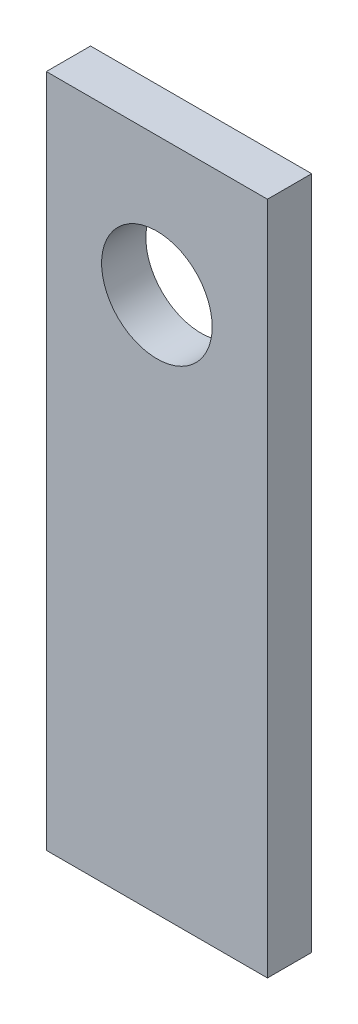
ISO-10303-21;
HEADER;
FILE_DESCRIPTION(('STEP AP214'),'2;1');
FILE_NAME('part.step','',(''),(''),'','','');
FILE_SCHEMA(('AUTOMOTIVE_DESIGN { 1 0 10303 214 1 1 1 1 }'));
ENDSEC;
DATA;
#1=APPLICATION_CONTEXT('core data for automotive mechanical design processes');
#2=APPLICATION_PROTOCOL_DEFINITION('international standard','automotive_design',2000,#1);
#3=PRODUCT_CONTEXT('',#1,'mechanical');
#4=PRODUCT('Part','Part','',(#3));
#5=PRODUCT_RELATED_PRODUCT_CATEGORY('part','',(#4));
#6=PRODUCT_DEFINITION_FORMATION('','',#4);
#7=PRODUCT_DEFINITION_CONTEXT('part definition',#1,'design');
#8=PRODUCT_DEFINITION('design','',#6,#7);
#9=PRODUCT_DEFINITION_SHAPE('','',#8);
#10=(LENGTH_UNIT() NAMED_UNIT(*) SI_UNIT(.MILLI.,.METRE.));
#11=(NAMED_UNIT(*) PLANE_ANGLE_UNIT() SI_UNIT($,.RADIAN.));
#12=(NAMED_UNIT(*) SI_UNIT($,.STERADIAN.) SOLID_ANGLE_UNIT());
#13=UNCERTAINTY_MEASURE_WITH_UNIT(LENGTH_MEASURE(1.E-05),#10,'distance_accuracy_value','');
#14=(GEOMETRIC_REPRESENTATION_CONTEXT(3) GLOBAL_UNCERTAINTY_ASSIGNED_CONTEXT((#13)) GLOBAL_UNIT_ASSIGNED_CONTEXT((#10,
#11,#12)) REPRESENTATION_CONTEXT('',''));
#15=CARTESIAN_POINT('',(0.,0.,0.));
#16=DIRECTION('',(0.,0.,1.));
#17=DIRECTION('',(1.,0.,0.));
#18=AXIS2_PLACEMENT_3D('',#15,#16,#17);
#19=CARTESIAN_POINT('',(10.,30.5,4.));
#20=DIRECTION('',(-1.,0.,0.));
#21=DIRECTION('',(0.,-1.,0.));
#22=AXIS2_PLACEMENT_3D('',#19,#20,#21);
#23=PLANE('',#22);
#24=DIRECTION('',(0.,1.,0.));
#25=VECTOR('',#24,1.);
#26=CARTESIAN_POINT('',(10.,30.5,0.));
#27=LINE('',#26,#25);
#28=CARTESIAN_POINT('',(10.,-30.5,0.));
#29=VERTEX_POINT('',#28);
#30=CARTESIAN_POINT('',(10.,30.5,0.));
#31=VERTEX_POINT('',#30);
#32=EDGE_CURVE('E119',#29,#31,#27,.T.);
#33=ORIENTED_EDGE('',*,*,#32,.T.);
#34=DIRECTION('',(0.,0.,-1.));
#35=VECTOR('',#34,1.);
#36=CARTESIAN_POINT('',(10.,30.5,4.));
#37=LINE('',#36,#35);
#38=CARTESIAN_POINT('',(10.,30.5,4.));
#39=VERTEX_POINT('',#38);
#40=EDGE_CURVE('E13',#39,#31,#37,.T.);
#41=ORIENTED_EDGE('',*,*,#40,.F.);
#42=DIRECTION('',(0.,1.,0.));
#43=VECTOR('',#42,1.);
#44=CARTESIAN_POINT('',(10.,30.5,4.));
#45=LINE('',#44,#43);
#46=CARTESIAN_POINT('',(10.,-30.5,4.));
#47=VERTEX_POINT('',#46);
#48=EDGE_CURVE('E103',#47,#39,#45,.T.);
#49=ORIENTED_EDGE('',*,*,#48,.F.);
#50=DIRECTION('',(0.,0.,-1.));
#51=VECTOR('',#50,1.);
#52=CARTESIAN_POINT('',(10.,-30.5,4.));
#53=LINE('',#52,#51);
#54=EDGE_CURVE('E115',#47,#29,#53,.T.);
#55=ORIENTED_EDGE('',*,*,#54,.T.);
#56=EDGE_LOOP('',(#33,#41,#49,#55));
#57=FACE_BOUND('',#56,.T.);
#58=ADVANCED_FACE('F51',(#57),#23,.F.);
#59=CARTESIAN_POINT('',(-10.,30.5,4.));
#60=DIRECTION('',(0.,-1.,0.));
#61=DIRECTION('',(0.,0.,-1.));
#62=AXIS2_PLACEMENT_3D('',#59,#60,#61);
#63=PLANE('',#62);
#64=DIRECTION('',(-1.,0.,0.));
#65=VECTOR('',#64,1.);
#66=CARTESIAN_POINT('',(-10.,30.5,0.));
#67=LINE('',#66,#65);
#68=CARTESIAN_POINT('',(-10.,30.5,0.));
#69=VERTEX_POINT('',#68);
#70=EDGE_CURVE('E108',#31,#69,#67,.T.);
#71=ORIENTED_EDGE('',*,*,#70,.T.);
#72=DIRECTION('',(0.,0.,-1.));
#73=VECTOR('',#72,1.);
#74=CARTESIAN_POINT('',(-10.,30.5,4.));
#75=LINE('',#74,#73);
#76=CARTESIAN_POINT('',(-10.,30.5,4.));
#77=VERTEX_POINT('',#76);
#78=EDGE_CURVE('E60',#77,#69,#75,.T.);
#79=ORIENTED_EDGE('',*,*,#78,.F.);
#80=DIRECTION('',(-1.,0.,0.));
#81=VECTOR('',#80,1.);
#82=CARTESIAN_POINT('',(-10.,30.5,4.));
#83=LINE('',#82,#81);
#84=EDGE_CURVE('E98',#39,#77,#83,.T.);
#85=ORIENTED_EDGE('',*,*,#84,.F.);
#86=ORIENTED_EDGE('',*,*,#40,.T.);
#87=EDGE_LOOP('',(#71,#79,#85,#86));
#88=FACE_BOUND('',#87,.T.);
#89=ADVANCED_FACE('F107',(#88),#63,.F.);
#90=CARTESIAN_POINT('',(-10.,30.5,4.));
#91=DIRECTION('',(1.,0.,0.));
#92=DIRECTION('',(0.,1.,0.));
#93=AXIS2_PLACEMENT_3D('',#90,#91,#92);
#94=PLANE('',#93);
#95=DIRECTION('',(0.,-1.,0.));
#96=VECTOR('',#95,1.);
#97=CARTESIAN_POINT('',(-10.,30.5,0.));
#98=LINE('',#97,#96);
#99=CARTESIAN_POINT('',(-10.,-30.5,0.));
#100=VERTEX_POINT('',#99);
#101=EDGE_CURVE('E85',#69,#100,#98,.T.);
#102=ORIENTED_EDGE('',*,*,#101,.T.);
#103=DIRECTION('',(0.,0.,-1.));
#104=VECTOR('',#103,1.);
#105=CARTESIAN_POINT('',(-10.,-30.5,4.));
#106=LINE('',#105,#104);
#107=CARTESIAN_POINT('',(-10.,-30.5,4.));
#108=VERTEX_POINT('',#107);
#109=EDGE_CURVE('E110',#108,#100,#106,.T.);
#110=ORIENTED_EDGE('',*,*,#109,.F.);
#111=DIRECTION('',(0.,-1.,0.));
#112=VECTOR('',#111,1.);
#113=CARTESIAN_POINT('',(-10.,30.5,4.));
#114=LINE('',#113,#112);
#115=EDGE_CURVE('E101',#77,#108,#114,.T.);
#116=ORIENTED_EDGE('',*,*,#115,.F.);
#117=ORIENTED_EDGE('',*,*,#78,.T.);
#118=EDGE_LOOP('',(#102,#110,#116,#117));
#119=FACE_BOUND('',#118,.T.);
#120=ADVANCED_FACE('F111',(#119),#94,.F.);
#121=CARTESIAN_POINT('',(-10.,-30.5,4.));
#122=DIRECTION('',(0.,1.,0.));
#123=DIRECTION('',(0.,0.,1.));
#124=AXIS2_PLACEMENT_3D('',#121,#122,#123);
#125=PLANE('',#124);
#126=CARTESIAN_POINT('',(-5.,-30.5,2.));
#127=DIRECTION('',(0.,-1.,0.));
#128=DIRECTION('',(0.,0.,-1.));
#129=AXIS2_PLACEMENT_3D('',#126,#127,#128);
#130=CIRCLE('',#129,1.19999999999999);
#131=CARTESIAN_POINT('',(-5.,-30.5,0.800000000000012));
#132=VERTEX_POINT('',#131);
#133=EDGE_CURVE('E159',#132,#132,#130,.T.);
#134=ORIENTED_EDGE('',*,*,#133,.F.);
#135=EDGE_LOOP('',(#134));
#136=FACE_BOUND('',#135,.T.);
#137=CARTESIAN_POINT('',(5.,-30.5,2.));
#138=DIRECTION('',(0.,-1.,0.));
#139=DIRECTION('',(0.,0.,-1.));
#140=AXIS2_PLACEMENT_3D('',#137,#138,#139);
#141=CIRCLE('',#140,1.19999999999999);
#142=CARTESIAN_POINT('',(5.,-30.5,0.800000000000013));
#143=VERTEX_POINT('',#142);
#144=EDGE_CURVE('E151',#143,#143,#141,.T.);
#145=ORIENTED_EDGE('',*,*,#144,.F.);
#146=EDGE_LOOP('',(#145));
#147=FACE_BOUND('',#146,.T.);
#148=DIRECTION('',(1.,0.,0.));
#149=VECTOR('',#148,1.);
#150=CARTESIAN_POINT('',(-10.,-30.5,0.));
#151=LINE('',#150,#149);
#152=EDGE_CURVE('E91',#100,#29,#151,.T.);
#153=ORIENTED_EDGE('',*,*,#152,.T.);
#154=ORIENTED_EDGE('',*,*,#54,.F.);
#155=DIRECTION('',(1.,0.,0.));
#156=VECTOR('',#155,1.);
#157=CARTESIAN_POINT('',(-10.,-30.5,4.));
#158=LINE('',#157,#156);
#159=EDGE_CURVE('E68',#108,#47,#158,.T.);
#160=ORIENTED_EDGE('',*,*,#159,.F.);
#161=ORIENTED_EDGE('',*,*,#109,.T.);
#162=EDGE_LOOP('',(#153,#154,#160,#161));
#163=FACE_BOUND('',#162,.T.);
#164=ADVANCED_FACE('F133',(#136,#147,#163),#125,.F.);
#165=CARTESIAN_POINT('',(0.,0.,4.));
#166=DIRECTION('',(0.,0.,1.));
#167=DIRECTION('',(1.,0.,0.));
#168=AXIS2_PLACEMENT_3D('',#165,#166,#167);
#169=PLANE('',#168);
#170=CARTESIAN_POINT('',(0.,18.,4.));
#171=DIRECTION('',(0.,0.,1.));
#172=DIRECTION('',(1.,0.,0.));
#173=AXIS2_PLACEMENT_3D('',#170,#171,#172);
#174=CIRCLE('',#173,5.);
#175=CARTESIAN_POINT('',(5.,18.,4.));
#176=VERTEX_POINT('',#175);
#177=EDGE_CURVE('E140',#176,#176,#174,.T.);
#178=ORIENTED_EDGE('',*,*,#177,.F.);
#179=EDGE_LOOP('',(#178));
#180=FACE_BOUND('',#179,.T.);
#181=ORIENTED_EDGE('',*,*,#48,.T.);
#182=ORIENTED_EDGE('',*,*,#84,.T.);
#183=ORIENTED_EDGE('',*,*,#115,.T.);
#184=ORIENTED_EDGE('',*,*,#159,.T.);
#185=EDGE_LOOP('',(#181,#182,#183,#184));
#186=FACE_BOUND('',#185,.T.);
#187=ADVANCED_FACE('F99',(#180,#186),#169,.T.);
#188=CARTESIAN_POINT('',(0.,0.,0.));
#189=DIRECTION('',(0.,0.,1.));
#190=DIRECTION('',(1.,0.,0.));
#191=AXIS2_PLACEMENT_3D('',#188,#189,#190);
#192=PLANE('',#191);
#193=CARTESIAN_POINT('',(0.,18.,0.));
#194=DIRECTION('',(0.,0.,1.));
#195=DIRECTION('',(1.,0.,0.));
#196=AXIS2_PLACEMENT_3D('',#193,#194,#195);
#197=CIRCLE('',#196,5.);
#198=CARTESIAN_POINT('',(5.,18.,0.));
#199=VERTEX_POINT('',#198);
#200=EDGE_CURVE('E123',#199,#199,#197,.T.);
#201=ORIENTED_EDGE('',*,*,#200,.T.);
#202=EDGE_LOOP('',(#201));
#203=FACE_BOUND('',#202,.T.);
#204=ORIENTED_EDGE('',*,*,#32,.F.);
#205=ORIENTED_EDGE('',*,*,#152,.F.);
#206=ORIENTED_EDGE('',*,*,#101,.F.);
#207=ORIENTED_EDGE('',*,*,#70,.F.);
#208=EDGE_LOOP('',(#204,#205,#206,#207));
#209=FACE_BOUND('',#208,.T.);
#210=ADVANCED_FACE('F136',(#203,#209),#192,.F.);
#211=CARTESIAN_POINT('',(0.,18.,0.));
#212=DIRECTION('',(0.,0.,1.));
#213=DIRECTION('',(1.,0.,0.));
#214=AXIS2_PLACEMENT_3D('',#211,#212,#213);
#215=CYLINDRICAL_SURFACE('',#214,5.);
#216=ORIENTED_EDGE('',*,*,#200,.F.);
#217=EDGE_LOOP('',(#216));
#218=FACE_BOUND('',#217,.T.);
#219=ORIENTED_EDGE('',*,*,#177,.T.);
#220=EDGE_LOOP('',(#219));
#221=FACE_BOUND('',#220,.T.);
#222=ADVANCED_FACE('F183',(#218,#221),#215,.F.);
#223=CARTESIAN_POINT('',(5.,-26.5,2.));
#224=DIRECTION('',(0.,1.,0.));
#225=DIRECTION('',(0.,0.,1.));
#226=AXIS2_PLACEMENT_3D('',#223,#224,#225);
#227=PLANE('',#226);
#228=CARTESIAN_POINT('',(5.,-26.5,2.));
#229=DIRECTION('',(0.,-1.,0.));
#230=DIRECTION('',(0.,0.,-1.));
#231=AXIS2_PLACEMENT_3D('',#228,#229,#230);
#232=CIRCLE('',#231,1.19999999999999);
#233=CARTESIAN_POINT('',(5.,-26.5,0.800000000000015));
#234=VERTEX_POINT('',#233);
#235=EDGE_CURVE('E144',#234,#234,#232,.T.);
#236=ORIENTED_EDGE('',*,*,#235,.T.);
#237=EDGE_LOOP('',(#236));
#238=FACE_BOUND('',#237,.T.);
#239=ADVANCED_FACE('F174',(#238),#227,.F.);
#240=CARTESIAN_POINT('',(5.,-30.5,2.));
#241=DIRECTION('',(0.,-1.,0.));
#242=DIRECTION('',(0.,0.,-1.));
#243=AXIS2_PLACEMENT_3D('',#240,#241,#242);
#244=CYLINDRICAL_SURFACE('',#243,1.19999999999999);
#245=ORIENTED_EDGE('',*,*,#235,.F.);
#246=EDGE_LOOP('',(#245));
#247=FACE_BOUND('',#246,.T.);
#248=ORIENTED_EDGE('',*,*,#144,.T.);
#249=EDGE_LOOP('',(#248));
#250=FACE_BOUND('',#249,.T.);
#251=ADVANCED_FACE('F171',(#247,#250),#244,.F.);
#252=CARTESIAN_POINT('',(-5.,-26.5,2.));
#253=DIRECTION('',(0.,1.,0.));
#254=DIRECTION('',(0.,0.,1.));
#255=AXIS2_PLACEMENT_3D('',#252,#253,#254);
#256=PLANE('',#255);
#257=CARTESIAN_POINT('',(-5.,-26.5,2.));
#258=DIRECTION('',(0.,-1.,0.));
#259=DIRECTION('',(0.,0.,-1.));
#260=AXIS2_PLACEMENT_3D('',#257,#258,#259);
#261=CIRCLE('',#260,1.19999999999999);
#262=CARTESIAN_POINT('',(-5.,-26.5,0.800000000000013));
#263=VERTEX_POINT('',#262);
#264=EDGE_CURVE('E155',#263,#263,#261,.T.);
#265=ORIENTED_EDGE('',*,*,#264,.T.);
#266=EDGE_LOOP('',(#265));
#267=FACE_BOUND('',#266,.T.);
#268=ADVANCED_FACE('F173',(#267),#256,.F.);
#269=CARTESIAN_POINT('',(-5.,-30.5,2.));
#270=DIRECTION('',(0.,-1.,0.));
#271=DIRECTION('',(0.,0.,-1.));
#272=AXIS2_PLACEMENT_3D('',#269,#270,#271);
#273=CYLINDRICAL_SURFACE('',#272,1.19999999999999);
#274=ORIENTED_EDGE('',*,*,#264,.F.);
#275=EDGE_LOOP('',(#274));
#276=FACE_BOUND('',#275,.T.);
#277=ORIENTED_EDGE('',*,*,#133,.T.);
#278=EDGE_LOOP('',(#277));
#279=FACE_BOUND('',#278,.T.);
#280=ADVANCED_FACE('F164',(#276,#279),#273,.F.);
#281=CLOSED_SHELL('',(#58,#89,#120,#164,#187,#210,#222,#239,#251,#268,#280));
#282=MANIFOLD_SOLID_BREP('B2',#281);
#283=ADVANCED_BREP_SHAPE_REPRESENTATION('',(#18,#282),#14);
#284=SHAPE_DEFINITION_REPRESENTATION(#9,#283);
ENDSEC;
END-ISO-10303-21;
